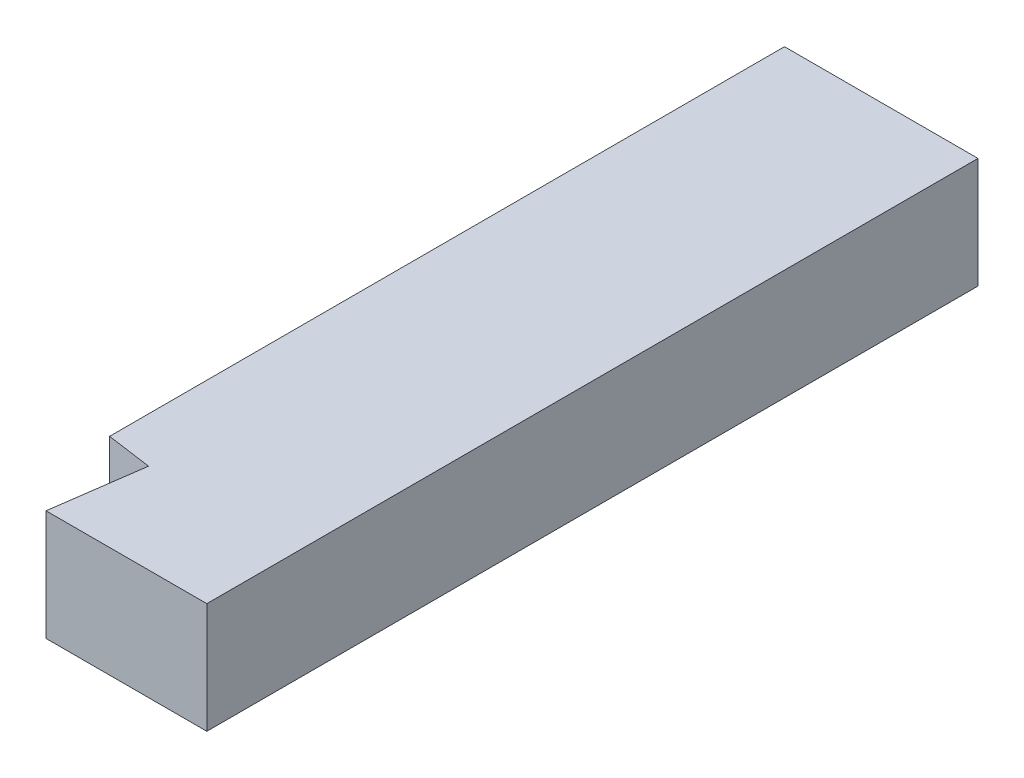
ISO-10303-21;
HEADER;
FILE_DESCRIPTION(('STEP AP214'),'2;1');
FILE_NAME('part.step','',(''),(''),'','','');
FILE_SCHEMA(('AUTOMOTIVE_DESIGN { 1 0 10303 214 1 1 1 1 }'));
ENDSEC;
DATA;
#1=APPLICATION_CONTEXT('core data for automotive mechanical design processes');
#2=APPLICATION_PROTOCOL_DEFINITION('international standard','automotive_design',2000,#1);
#3=PRODUCT_CONTEXT('',#1,'mechanical');
#4=PRODUCT('Part','Part','',(#3));
#5=PRODUCT_RELATED_PRODUCT_CATEGORY('part','',(#4));
#6=PRODUCT_DEFINITION_FORMATION('','',#4);
#7=PRODUCT_DEFINITION_CONTEXT('part definition',#1,'design');
#8=PRODUCT_DEFINITION('design','',#6,#7);
#9=PRODUCT_DEFINITION_SHAPE('','',#8);
#10=(LENGTH_UNIT() NAMED_UNIT(*) SI_UNIT(.MILLI.,.METRE.));
#11=(NAMED_UNIT(*) PLANE_ANGLE_UNIT() SI_UNIT($,.RADIAN.));
#12=(NAMED_UNIT(*) SI_UNIT($,.STERADIAN.) SOLID_ANGLE_UNIT());
#13=UNCERTAINTY_MEASURE_WITH_UNIT(LENGTH_MEASURE(1.E-05),#10,'distance_accuracy_value','');
#14=(GEOMETRIC_REPRESENTATION_CONTEXT(3) GLOBAL_UNCERTAINTY_ASSIGNED_CONTEXT((#13)) GLOBAL_UNIT_ASSIGNED_CONTEXT((#10,
#11,#12)) REPRESENTATION_CONTEXT('',''));
#15=CARTESIAN_POINT('',(0.,0.,0.));
#16=DIRECTION('',(0.,0.,1.));
#17=DIRECTION('',(1.,0.,0.));
#18=AXIS2_PLACEMENT_3D('',#15,#16,#17);
#19=CARTESIAN_POINT('',(-50.8,25.4,354.289954614));
#20=DIRECTION('',(0.,-1.,0.));
#21=DIRECTION('',(0.,0.,-1.));
#22=AXIS2_PLACEMENT_3D('',#19,#20,#21);
#23=PLANE('',#22);
#24=DIRECTION('',(-1.,0.,0.));
#25=VECTOR('',#24,1.);
#26=CARTESIAN_POINT('',(-50.8,25.4,354.289954614));
#27=LINE('',#26,#25);
#28=CARTESIAN_POINT('',(38.1,25.4,354.289954614));
#29=VERTEX_POINT('',#28);
#30=CARTESIAN_POINT('',(-35.7873727748296,25.4,354.289954614));
#31=VERTEX_POINT('',#30);
#32=EDGE_CURVE('E114',#29,#31,#27,.T.);
#33=ORIENTED_EDGE('',*,*,#32,.F.);
#34=DIRECTION('',(0.,0.,1.));
#35=VECTOR('',#34,1.);
#36=CARTESIAN_POINT('',(38.1,25.4,354.289954614));
#37=LINE('',#36,#35);
#38=CARTESIAN_POINT('',(38.1,25.4,0.));
#39=VERTEX_POINT('',#38);
#40=EDGE_CURVE('E94',#39,#29,#37,.T.);
#41=ORIENTED_EDGE('',*,*,#40,.F.);
#42=DIRECTION('',(-1.,0.,0.));
#43=VECTOR('',#42,1.);
#44=CARTESIAN_POINT('',(-50.8,25.4,0.));
#45=LINE('',#44,#43);
#46=CARTESIAN_POINT('',(-50.8,25.4,0.));
#47=VERTEX_POINT('',#46);
#48=EDGE_CURVE('E121',#39,#47,#45,.T.);
#49=ORIENTED_EDGE('',*,*,#48,.T.);
#50=DIRECTION('',(0.,0.,-1.));
#51=VECTOR('',#50,1.);
#52=CARTESIAN_POINT('',(-50.8,25.4,354.289954614));
#53=LINE('',#52,#51);
#54=CARTESIAN_POINT('',(-50.8,25.4,310.060441541933));
#55=VERTEX_POINT('',#54);
#56=EDGE_CURVE('E11',#55,#47,#53,.T.);
#57=ORIENTED_EDGE('',*,*,#56,.F.);
#58=DIRECTION('',(0.99026806874157,0.,0.13917310096007));
#59=VECTOR('',#58,1.);
#60=CARTESIAN_POINT('',(-44.7043469838708,25.4,310.917129704876));
#61=LINE('',#60,#59);
#62=CARTESIAN_POINT('',(-29.9825016178071,25.4,312.986150140982));
#63=VERTEX_POINT('',#62);
#64=EDGE_CURVE('E125',#55,#63,#61,.T.);
#65=ORIENTED_EDGE('',*,*,#64,.T.);
#66=DIRECTION('',(-0.139173100960069,0.,0.99026806874157));
#67=VECTOR('',#66,1.);
#68=CARTESIAN_POINT('',(-36.0781546339363,25.4,356.358975050106));
#69=LINE('',#68,#67);
#70=EDGE_CURVE('E133',#63,#31,#69,.T.);
#71=ORIENTED_EDGE('',*,*,#70,.T.);
#72=EDGE_LOOP('',(#33,#41,#49,#57,#65,#71));
#73=FACE_BOUND('',#72,.T.);
#74=ADVANCED_FACE('F39',(#73),#23,.F.);
#75=CARTESIAN_POINT('',(-50.8,25.4,354.289954614));
#76=DIRECTION('',(1.,0.,0.));
#77=DIRECTION('',(0.,1.,0.));
#78=AXIS2_PLACEMENT_3D('',#75,#76,#77);
#79=PLANE('',#78);
#80=DIRECTION('',(0.,0.,-1.));
#81=VECTOR('',#80,1.);
#82=CARTESIAN_POINT('',(-50.8,-25.4,354.289954614));
#83=LINE('',#82,#81);
#84=CARTESIAN_POINT('',(-50.8,-25.4,310.060441541933));
#85=VERTEX_POINT('',#84);
#86=CARTESIAN_POINT('',(-50.8,-25.4,0.));
#87=VERTEX_POINT('',#86);
#88=EDGE_CURVE('E47',#85,#87,#83,.T.);
#89=ORIENTED_EDGE('',*,*,#88,.F.);
#90=DIRECTION('',(0.,1.,0.));
#91=VECTOR('',#90,1.);
#92=CARTESIAN_POINT('',(-50.8,-25.4,310.060441541933));
#93=LINE('',#92,#91);
#94=EDGE_CURVE('E142',#85,#55,#93,.T.);
#95=ORIENTED_EDGE('',*,*,#94,.T.);
#96=ORIENTED_EDGE('',*,*,#56,.T.);
#97=DIRECTION('',(0.,-1.,0.));
#98=VECTOR('',#97,1.);
#99=CARTESIAN_POINT('',(-50.8,25.4,0.));
#100=LINE('',#99,#98);
#101=EDGE_CURVE('E124',#47,#87,#100,.T.);
#102=ORIENTED_EDGE('',*,*,#101,.T.);
#103=EDGE_LOOP('',(#89,#95,#96,#102));
#104=FACE_BOUND('',#103,.T.);
#105=ADVANCED_FACE('F163',(#104),#79,.F.);
#106=CARTESIAN_POINT('',(-50.8,-25.4,354.289954614));
#107=DIRECTION('',(0.,1.,0.));
#108=DIRECTION('',(0.,0.,1.));
#109=AXIS2_PLACEMENT_3D('',#106,#107,#108);
#110=PLANE('',#109);
#111=DIRECTION('',(1.,0.,0.));
#112=VECTOR('',#111,1.);
#113=CARTESIAN_POINT('',(-50.8,-25.4,0.));
#114=LINE('',#113,#112);
#115=CARTESIAN_POINT('',(38.1,-25.4,0.));
#116=VERTEX_POINT('',#115);
#117=EDGE_CURVE('E108',#87,#116,#114,.T.);
#118=ORIENTED_EDGE('',*,*,#117,.T.);
#119=DIRECTION('',(0.,0.,1.));
#120=VECTOR('',#119,1.);
#121=CARTESIAN_POINT('',(38.1,-25.4,354.289954614));
#122=LINE('',#121,#120);
#123=CARTESIAN_POINT('',(38.1,-25.4,354.289954614));
#124=VERTEX_POINT('',#123);
#125=EDGE_CURVE('E54',#116,#124,#122,.T.);
#126=ORIENTED_EDGE('',*,*,#125,.T.);
#127=DIRECTION('',(1.,0.,0.));
#128=VECTOR('',#127,1.);
#129=CARTESIAN_POINT('',(-50.8,-25.4,354.289954614));
#130=LINE('',#129,#128);
#131=CARTESIAN_POINT('',(-35.7873727748296,-25.4,354.289954614));
#132=VERTEX_POINT('',#131);
#133=EDGE_CURVE('E106',#132,#124,#130,.T.);
#134=ORIENTED_EDGE('',*,*,#133,.F.);
#135=DIRECTION('',(0.139173100960069,0.,-0.99026806874157));
#136=VECTOR('',#135,1.);
#137=CARTESIAN_POINT('',(-31.75,-25.4,325.562554614));
#138=LINE('',#137,#136);
#139=CARTESIAN_POINT('',(-29.9825016178071,-25.4,312.986150140982));
#140=VERTEX_POINT('',#139);
#141=EDGE_CURVE('E62',#132,#140,#138,.T.);
#142=ORIENTED_EDGE('',*,*,#141,.T.);
#143=DIRECTION('',(-0.99026806874157,0.,-0.13917310096007));
#144=VECTOR('',#143,1.);
#145=CARTESIAN_POINT('',(-29.9825016178071,-25.4,312.986150140982));
#146=LINE('',#145,#144);
#147=EDGE_CURVE('E99',#140,#85,#146,.T.);
#148=ORIENTED_EDGE('',*,*,#147,.T.);
#149=ORIENTED_EDGE('',*,*,#88,.T.);
#150=EDGE_LOOP('',(#118,#126,#134,#142,#148,#149));
#151=FACE_BOUND('',#150,.T.);
#152=ADVANCED_FACE('F105',(#151),#110,.F.);
#153=CARTESIAN_POINT('',(0.,0.,354.289954614));
#154=DIRECTION('',(0.,0.,1.));
#155=DIRECTION('',(1.,0.,0.));
#156=AXIS2_PLACEMENT_3D('',#153,#154,#155);
#157=PLANE('',#156);
#158=DIRECTION('',(0.,1.,0.));
#159=VECTOR('',#158,1.);
#160=CARTESIAN_POINT('',(38.1,-25.4,354.289954614));
#161=LINE('',#160,#159);
#162=EDGE_CURVE('E91',#124,#29,#161,.T.);
#163=ORIENTED_EDGE('',*,*,#162,.T.);
#164=ORIENTED_EDGE('',*,*,#32,.T.);
#165=DIRECTION('',(0.,1.,0.));
#166=VECTOR('',#165,1.);
#167=CARTESIAN_POINT('',(-35.7873727748296,-25.4,354.289954614));
#168=LINE('',#167,#166);
#169=EDGE_CURVE('E112',#132,#31,#168,.T.);
#170=ORIENTED_EDGE('',*,*,#169,.F.);
#171=ORIENTED_EDGE('',*,*,#133,.T.);
#172=EDGE_LOOP('',(#163,#164,#170,#171));
#173=FACE_BOUND('',#172,.T.);
#174=ADVANCED_FACE('F111',(#173),#157,.T.);
#175=CARTESIAN_POINT('',(0.,0.,0.));
#176=DIRECTION('',(0.,0.,1.));
#177=DIRECTION('',(1.,0.,0.));
#178=AXIS2_PLACEMENT_3D('',#175,#176,#177);
#179=PLANE('',#178);
#180=ORIENTED_EDGE('',*,*,#48,.F.);
#181=DIRECTION('',(0.,1.,0.));
#182=VECTOR('',#181,1.);
#183=CARTESIAN_POINT('',(38.1,-25.4,0.));
#184=LINE('',#183,#182);
#185=EDGE_CURVE('E100',#116,#39,#184,.T.);
#186=ORIENTED_EDGE('',*,*,#185,.F.);
#187=ORIENTED_EDGE('',*,*,#117,.F.);
#188=ORIENTED_EDGE('',*,*,#101,.F.);
#189=EDGE_LOOP('',(#180,#186,#187,#188));
#190=FACE_BOUND('',#189,.T.);
#191=ADVANCED_FACE('F160',(#190),#179,.F.);
#192=CARTESIAN_POINT('',(-29.9825016178071,-25.4,312.986150140982));
#193=DIRECTION('',(0.13917310096007,0.,-0.99026806874157));
#194=DIRECTION('',(-0.99026806874157,0.,-0.13917310096007));
#195=AXIS2_PLACEMENT_3D('',#192,#193,#194);
#196=PLANE('',#195);
#197=ORIENTED_EDGE('',*,*,#94,.F.);
#198=ORIENTED_EDGE('',*,*,#147,.F.);
#199=DIRECTION('',(0.,1.,0.));
#200=VECTOR('',#199,1.);
#201=CARTESIAN_POINT('',(-29.9825016178071,-25.4,312.986150140982));
#202=LINE('',#201,#200);
#203=EDGE_CURVE('E136',#140,#63,#202,.T.);
#204=ORIENTED_EDGE('',*,*,#203,.T.);
#205=ORIENTED_EDGE('',*,*,#64,.F.);
#206=EDGE_LOOP('',(#197,#198,#204,#205));
#207=FACE_BOUND('',#206,.T.);
#208=ADVANCED_FACE('F165',(#207),#196,.F.);
#209=CARTESIAN_POINT('',(-31.75,-25.4,325.562554614));
#210=DIRECTION('',(0.99026806874157,0.,0.139173100960069));
#211=DIRECTION('',(0.139173100960069,0.,-0.99026806874157));
#212=AXIS2_PLACEMENT_3D('',#209,#210,#211);
#213=PLANE('',#212);
#214=ORIENTED_EDGE('',*,*,#203,.F.);
#215=ORIENTED_EDGE('',*,*,#141,.F.);
#216=ORIENTED_EDGE('',*,*,#169,.T.);
#217=ORIENTED_EDGE('',*,*,#70,.F.);
#218=EDGE_LOOP('',(#214,#215,#216,#217));
#219=FACE_BOUND('',#218,.T.);
#220=ADVANCED_FACE('F167',(#219),#213,.F.);
#221=CARTESIAN_POINT('',(38.1,-25.4,354.289954614));
#222=DIRECTION('',(-1.,0.,0.));
#223=DIRECTION('',(0.,0.,1.));
#224=AXIS2_PLACEMENT_3D('',#221,#222,#223);
#225=PLANE('',#224);
#226=ORIENTED_EDGE('',*,*,#40,.T.);
#227=ORIENTED_EDGE('',*,*,#162,.F.);
#228=ORIENTED_EDGE('',*,*,#125,.F.);
#229=ORIENTED_EDGE('',*,*,#185,.T.);
#230=EDGE_LOOP('',(#226,#227,#228,#229));
#231=FACE_BOUND('',#230,.T.);
#232=ADVANCED_FACE('F92',(#231),#225,.F.);
#233=CLOSED_SHELL('',(#74,#105,#152,#174,#191,#208,#220,#232));
#234=MANIFOLD_SOLID_BREP('B2',#233);
#235=ADVANCED_BREP_SHAPE_REPRESENTATION('',(#18,#234),#14);
#236=SHAPE_DEFINITION_REPRESENTATION(#9,#235);
ENDSEC;
END-ISO-10303-21;
